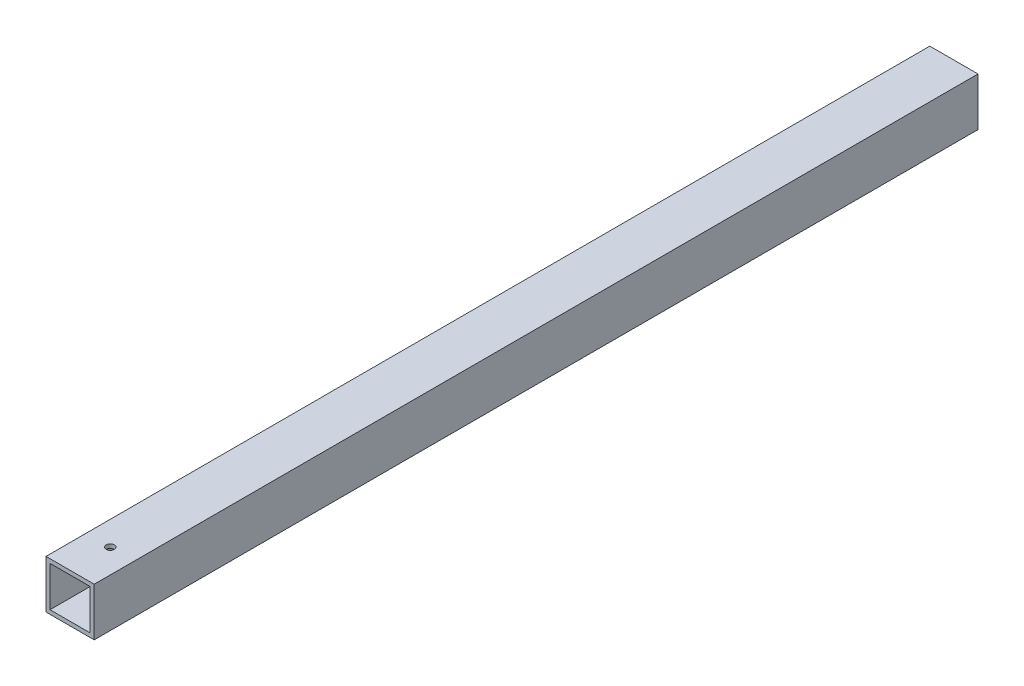
ISO-10303-21;
HEADER;
FILE_DESCRIPTION(('STEP AP214'),'2;1');
FILE_NAME('part.step','',(''),(''),'','','');
FILE_SCHEMA(('AUTOMOTIVE_DESIGN { 1 0 10303 214 1 1 1 1 }'));
ENDSEC;
DATA;
#1=APPLICATION_CONTEXT('core data for automotive mechanical design processes');
#2=APPLICATION_PROTOCOL_DEFINITION('international standard','automotive_design',2000,#1);
#3=PRODUCT_CONTEXT('',#1,'mechanical');
#4=PRODUCT('Part','Part','',(#3));
#5=PRODUCT_RELATED_PRODUCT_CATEGORY('part','',(#4));
#6=PRODUCT_DEFINITION_FORMATION('','',#4);
#7=PRODUCT_DEFINITION_CONTEXT('part definition',#1,'design');
#8=PRODUCT_DEFINITION('design','',#6,#7);
#9=PRODUCT_DEFINITION_SHAPE('','',#8);
#10=(LENGTH_UNIT() NAMED_UNIT(*) SI_UNIT(.MILLI.,.METRE.));
#11=(NAMED_UNIT(*) PLANE_ANGLE_UNIT() SI_UNIT($,.RADIAN.));
#12=(NAMED_UNIT(*) SI_UNIT($,.STERADIAN.) SOLID_ANGLE_UNIT());
#13=UNCERTAINTY_MEASURE_WITH_UNIT(LENGTH_MEASURE(1.E-05),#10,'distance_accuracy_value','');
#14=(GEOMETRIC_REPRESENTATION_CONTEXT(3) GLOBAL_UNCERTAINTY_ASSIGNED_CONTEXT((#13)) GLOBAL_UNIT_ASSIGNED_CONTEXT((#10,
#11,#12)) REPRESENTATION_CONTEXT('',''));
#15=CARTESIAN_POINT('',(0.,0.,0.));
#16=DIRECTION('',(0.,0.,1.));
#17=DIRECTION('',(1.,0.,0.));
#18=AXIS2_PLACEMENT_3D('',#15,#16,#17);
#19=CARTESIAN_POINT('',(0.,0.,220.00227405));
#20=DIRECTION('',(0.,0.,-1.));
#21=DIRECTION('',(-1.,0.,0.));
#22=AXIS2_PLACEMENT_3D('',#19,#20,#21);
#23=PLANE('',#22);
#24=DIRECTION('',(0.,-1.,0.));
#25=VECTOR('',#24,1.);
#26=CARTESIAN_POINT('',(0.,0.,220.00227405));
#27=LINE('',#26,#25);
#28=CARTESIAN_POINT('',(0.,12.,220.00227405));
#29=VERTEX_POINT('',#28);
#30=CARTESIAN_POINT('',(0.,0.,220.00227405));
#31=VERTEX_POINT('',#30);
#32=EDGE_CURVE('E137',#29,#31,#27,.T.);
#33=ORIENTED_EDGE('',*,*,#32,.T.);
#34=DIRECTION('',(1.,0.,0.));
#35=VECTOR('',#34,1.);
#36=CARTESIAN_POINT('',(0.,0.,220.00227405));
#37=LINE('',#36,#35);
#38=CARTESIAN_POINT('',(12.,0.,220.00227405));
#39=VERTEX_POINT('',#38);
#40=EDGE_CURVE('E140',#31,#39,#37,.T.);
#41=ORIENTED_EDGE('',*,*,#40,.T.);
#42=DIRECTION('',(0.,1.,0.));
#43=VECTOR('',#42,1.);
#44=CARTESIAN_POINT('',(12.,0.,220.00227405));
#45=LINE('',#44,#43);
#46=CARTESIAN_POINT('',(12.,12.,220.00227405));
#47=VERTEX_POINT('',#46);
#48=EDGE_CURVE('E143',#39,#47,#45,.T.);
#49=ORIENTED_EDGE('',*,*,#48,.T.);
#50=DIRECTION('',(-1.,0.,0.));
#51=VECTOR('',#50,1.);
#52=CARTESIAN_POINT('',(0.,12.,220.00227405));
#53=LINE('',#52,#51);
#54=EDGE_CURVE('E145',#47,#29,#53,.T.);
#55=ORIENTED_EDGE('',*,*,#54,.T.);
#56=EDGE_LOOP('',(#33,#41,#49,#55));
#57=FACE_BOUND('',#56,.T.);
#58=DIRECTION('',(0.,-1.,0.));
#59=VECTOR('',#58,1.);
#60=CARTESIAN_POINT('',(1.,1.,220.00227405));
#61=LINE('',#60,#59);
#62=CARTESIAN_POINT('',(1.,11.,220.00227405));
#63=VERTEX_POINT('',#62);
#64=CARTESIAN_POINT('',(1.,1.,220.00227405));
#65=VERTEX_POINT('',#64);
#66=EDGE_CURVE('E99',#63,#65,#61,.T.);
#67=ORIENTED_EDGE('',*,*,#66,.F.);
#68=DIRECTION('',(-1.,0.,0.));
#69=VECTOR('',#68,1.);
#70=CARTESIAN_POINT('',(1.,11.,220.00227405));
#71=LINE('',#70,#69);
#72=CARTESIAN_POINT('',(11.,11.,220.00227405));
#73=VERTEX_POINT('',#72);
#74=EDGE_CURVE('E121',#73,#63,#71,.T.);
#75=ORIENTED_EDGE('',*,*,#74,.F.);
#76=DIRECTION('',(0.,1.,0.));
#77=VECTOR('',#76,1.);
#78=CARTESIAN_POINT('',(11.,1.,220.00227405));
#79=LINE('',#78,#77);
#80=CARTESIAN_POINT('',(11.,1.,220.00227405));
#81=VERTEX_POINT('',#80);
#82=EDGE_CURVE('E119',#81,#73,#79,.T.);
#83=ORIENTED_EDGE('',*,*,#82,.F.);
#84=DIRECTION('',(1.,0.,0.));
#85=VECTOR('',#84,1.);
#86=CARTESIAN_POINT('',(1.,1.,220.00227405));
#87=LINE('',#86,#85);
#88=EDGE_CURVE('E107',#65,#81,#87,.T.);
#89=ORIENTED_EDGE('',*,*,#88,.F.);
#90=EDGE_LOOP('',(#67,#75,#83,#89));
#91=FACE_BOUND('',#90,.T.);
#92=ADVANCED_FACE('F33',(#57,#91),#23,.F.);
#93=CARTESIAN_POINT('',(0.,0.,0.));
#94=DIRECTION('',(0.,0.,-1.));
#95=DIRECTION('',(-1.,0.,0.));
#96=AXIS2_PLACEMENT_3D('',#93,#94,#95);
#97=PLANE('',#96);
#98=DIRECTION('',(0.,-1.,0.));
#99=VECTOR('',#98,1.);
#100=CARTESIAN_POINT('',(0.,0.,0.));
#101=LINE('',#100,#99);
#102=CARTESIAN_POINT('',(0.,12.,0.));
#103=VERTEX_POINT('',#102);
#104=CARTESIAN_POINT('',(0.,0.,0.));
#105=VERTEX_POINT('',#104);
#106=EDGE_CURVE('E115',#103,#105,#101,.T.);
#107=ORIENTED_EDGE('',*,*,#106,.F.);
#108=DIRECTION('',(-1.,0.,0.));
#109=VECTOR('',#108,1.);
#110=CARTESIAN_POINT('',(0.,12.,0.));
#111=LINE('',#110,#109);
#112=CARTESIAN_POINT('',(12.,12.,0.));
#113=VERTEX_POINT('',#112);
#114=EDGE_CURVE('E141',#113,#103,#111,.T.);
#115=ORIENTED_EDGE('',*,*,#114,.F.);
#116=DIRECTION('',(0.,1.,0.));
#117=VECTOR('',#116,1.);
#118=CARTESIAN_POINT('',(12.,0.,0.));
#119=LINE('',#118,#117);
#120=CARTESIAN_POINT('',(12.,0.,0.));
#121=VERTEX_POINT('',#120);
#122=EDGE_CURVE('E152',#121,#113,#119,.T.);
#123=ORIENTED_EDGE('',*,*,#122,.F.);
#124=DIRECTION('',(1.,0.,0.));
#125=VECTOR('',#124,1.);
#126=CARTESIAN_POINT('',(0.,0.,0.));
#127=LINE('',#126,#125);
#128=EDGE_CURVE('E150',#105,#121,#127,.T.);
#129=ORIENTED_EDGE('',*,*,#128,.F.);
#130=EDGE_LOOP('',(#107,#115,#123,#129));
#131=FACE_BOUND('',#130,.T.);
#132=DIRECTION('',(-1.,0.,0.));
#133=VECTOR('',#132,1.);
#134=CARTESIAN_POINT('',(1.,11.,0.));
#135=LINE('',#134,#133);
#136=CARTESIAN_POINT('',(11.,11.,0.));
#137=VERTEX_POINT('',#136);
#138=CARTESIAN_POINT('',(1.,11.,0.));
#139=VERTEX_POINT('',#138);
#140=EDGE_CURVE('E108',#137,#139,#135,.T.);
#141=ORIENTED_EDGE('',*,*,#140,.T.);
#142=DIRECTION('',(0.,-1.,0.));
#143=VECTOR('',#142,1.);
#144=CARTESIAN_POINT('',(1.,1.,0.));
#145=LINE('',#144,#143);
#146=CARTESIAN_POINT('',(1.,1.,0.));
#147=VERTEX_POINT('',#146);
#148=EDGE_CURVE('E57',#139,#147,#145,.T.);
#149=ORIENTED_EDGE('',*,*,#148,.T.);
#150=DIRECTION('',(1.,0.,0.));
#151=VECTOR('',#150,1.);
#152=CARTESIAN_POINT('',(1.,1.,0.));
#153=LINE('',#152,#151);
#154=CARTESIAN_POINT('',(11.,1.,0.));
#155=VERTEX_POINT('',#154);
#156=EDGE_CURVE('E114',#147,#155,#153,.T.);
#157=ORIENTED_EDGE('',*,*,#156,.T.);
#158=DIRECTION('',(0.,1.,0.));
#159=VECTOR('',#158,1.);
#160=CARTESIAN_POINT('',(11.,1.,0.));
#161=LINE('',#160,#159);
#162=EDGE_CURVE('E129',#155,#137,#161,.T.);
#163=ORIENTED_EDGE('',*,*,#162,.T.);
#164=EDGE_LOOP('',(#141,#149,#157,#163));
#165=FACE_BOUND('',#164,.T.);
#166=ADVANCED_FACE('F171',(#131,#165),#97,.T.);
#167=CARTESIAN_POINT('',(0.,0.,220.00227405));
#168=DIRECTION('',(1.,0.,0.));
#169=DIRECTION('',(0.,0.,-1.));
#170=AXIS2_PLACEMENT_3D('',#167,#168,#169);
#171=PLANE('',#170);
#172=ORIENTED_EDGE('',*,*,#106,.T.);
#173=DIRECTION('',(0.,0.,-1.));
#174=VECTOR('',#173,1.);
#175=CARTESIAN_POINT('',(0.,0.,220.00227405));
#176=LINE('',#175,#174);
#177=EDGE_CURVE('E11',#31,#105,#176,.T.);
#178=ORIENTED_EDGE('',*,*,#177,.F.);
#179=ORIENTED_EDGE('',*,*,#32,.F.);
#180=DIRECTION('',(0.,0.,-1.));
#181=VECTOR('',#180,1.);
#182=CARTESIAN_POINT('',(0.,12.,220.00227405));
#183=LINE('',#182,#181);
#184=EDGE_CURVE('E147',#29,#103,#183,.T.);
#185=ORIENTED_EDGE('',*,*,#184,.T.);
#186=EDGE_LOOP('',(#172,#178,#179,#185));
#187=FACE_BOUND('',#186,.T.);
#188=ADVANCED_FACE('F35',(#187),#171,.F.);
#189=CARTESIAN_POINT('',(0.,0.,220.00227405));
#190=DIRECTION('',(0.,1.,0.));
#191=DIRECTION('',(0.,0.,1.));
#192=AXIS2_PLACEMENT_3D('',#189,#190,#191);
#193=PLANE('',#192);
#194=CARTESIAN_POINT('',(6.,0.,210.00227405));
#195=DIRECTION('',(0.,-1.,0.));
#196=DIRECTION('',(0.,0.,-1.));
#197=AXIS2_PLACEMENT_3D('',#194,#195,#196);
#198=CIRCLE('',#197,1.);
#199=CARTESIAN_POINT('',(6.,0.,209.00227405));
#200=VERTEX_POINT('',#199);
#201=EDGE_CURVE('E208',#200,#200,#198,.T.);
#202=ORIENTED_EDGE('',*,*,#201,.F.);
#203=EDGE_LOOP('',(#202));
#204=FACE_BOUND('',#203,.T.);
#205=ORIENTED_EDGE('',*,*,#128,.T.);
#206=DIRECTION('',(0.,0.,-1.));
#207=VECTOR('',#206,1.);
#208=CARTESIAN_POINT('',(12.,0.,220.00227405));
#209=LINE('',#208,#207);
#210=EDGE_CURVE('E42',#39,#121,#209,.T.);
#211=ORIENTED_EDGE('',*,*,#210,.F.);
#212=ORIENTED_EDGE('',*,*,#40,.F.);
#213=ORIENTED_EDGE('',*,*,#177,.T.);
#214=EDGE_LOOP('',(#205,#211,#212,#213));
#215=FACE_BOUND('',#214,.T.);
#216=ADVANCED_FACE('F181',(#204,#215),#193,.F.);
#217=CARTESIAN_POINT('',(12.,0.,220.00227405));
#218=DIRECTION('',(-1.,0.,0.));
#219=DIRECTION('',(0.,0.,1.));
#220=AXIS2_PLACEMENT_3D('',#217,#218,#219);
#221=PLANE('',#220);
#222=ORIENTED_EDGE('',*,*,#122,.T.);
#223=DIRECTION('',(0.,0.,-1.));
#224=VECTOR('',#223,1.);
#225=CARTESIAN_POINT('',(12.,12.,220.00227405));
#226=LINE('',#225,#224);
#227=EDGE_CURVE('E157',#47,#113,#226,.T.);
#228=ORIENTED_EDGE('',*,*,#227,.F.);
#229=ORIENTED_EDGE('',*,*,#48,.F.);
#230=ORIENTED_EDGE('',*,*,#210,.T.);
#231=EDGE_LOOP('',(#222,#228,#229,#230));
#232=FACE_BOUND('',#231,.T.);
#233=ADVANCED_FACE('F165',(#232),#221,.F.);
#234=CARTESIAN_POINT('',(0.,12.,220.00227405));
#235=DIRECTION('',(0.,-1.,0.));
#236=DIRECTION('',(0.,0.,-1.));
#237=AXIS2_PLACEMENT_3D('',#234,#235,#236);
#238=PLANE('',#237);
#239=CARTESIAN_POINT('',(6.,12.,210.00227405));
#240=DIRECTION('',(0.,-1.,0.));
#241=DIRECTION('',(0.,0.,-1.));
#242=AXIS2_PLACEMENT_3D('',#239,#240,#241);
#243=CIRCLE('',#242,1.);
#244=CARTESIAN_POINT('',(6.,12.,209.00227405));
#245=VERTEX_POINT('',#244);
#246=EDGE_CURVE('E206',#245,#245,#243,.T.);
#247=ORIENTED_EDGE('',*,*,#246,.T.);
#248=EDGE_LOOP('',(#247));
#249=FACE_BOUND('',#248,.T.);
#250=ORIENTED_EDGE('',*,*,#114,.T.);
#251=ORIENTED_EDGE('',*,*,#184,.F.);
#252=ORIENTED_EDGE('',*,*,#54,.F.);
#253=ORIENTED_EDGE('',*,*,#227,.T.);
#254=EDGE_LOOP('',(#250,#251,#252,#253));
#255=FACE_BOUND('',#254,.T.);
#256=ADVANCED_FACE('F175',(#249,#255),#238,.F.);
#257=CARTESIAN_POINT('',(1.,1.,220.00227405));
#258=DIRECTION('',(1.,0.,0.));
#259=DIRECTION('',(0.,0.,-1.));
#260=AXIS2_PLACEMENT_3D('',#257,#258,#259);
#261=PLANE('',#260);
#262=ORIENTED_EDGE('',*,*,#148,.F.);
#263=DIRECTION('',(0.,0.,-1.));
#264=VECTOR('',#263,1.);
#265=CARTESIAN_POINT('',(1.,11.,220.00227405));
#266=LINE('',#265,#264);
#267=EDGE_CURVE('E103',#63,#139,#266,.T.);
#268=ORIENTED_EDGE('',*,*,#267,.F.);
#269=ORIENTED_EDGE('',*,*,#66,.T.);
#270=DIRECTION('',(0.,0.,-1.));
#271=VECTOR('',#270,1.);
#272=CARTESIAN_POINT('',(1.,1.,220.00227405));
#273=LINE('',#272,#271);
#274=EDGE_CURVE('E102',#65,#147,#273,.T.);
#275=ORIENTED_EDGE('',*,*,#274,.T.);
#276=EDGE_LOOP('',(#262,#268,#269,#275));
#277=FACE_BOUND('',#276,.T.);
#278=ADVANCED_FACE('F101',(#277),#261,.T.);
#279=CARTESIAN_POINT('',(1.,1.,220.00227405));
#280=DIRECTION('',(0.,1.,0.));
#281=DIRECTION('',(0.,0.,1.));
#282=AXIS2_PLACEMENT_3D('',#279,#280,#281);
#283=PLANE('',#282);
#284=CARTESIAN_POINT('',(6.,1.,210.00227405));
#285=DIRECTION('',(0.,1.,0.));
#286=DIRECTION('',(0.,0.,1.));
#287=AXIS2_PLACEMENT_3D('',#284,#285,#286);
#288=CIRCLE('',#287,1.);
#289=CARTESIAN_POINT('',(6.,1.,211.00227405));
#290=VERTEX_POINT('',#289);
#291=EDGE_CURVE('E127',#290,#290,#288,.T.);
#292=ORIENTED_EDGE('',*,*,#291,.F.);
#293=EDGE_LOOP('',(#292));
#294=FACE_BOUND('',#293,.T.);
#295=ORIENTED_EDGE('',*,*,#156,.F.);
#296=ORIENTED_EDGE('',*,*,#274,.F.);
#297=ORIENTED_EDGE('',*,*,#88,.T.);
#298=DIRECTION('',(0.,0.,-1.));
#299=VECTOR('',#298,1.);
#300=CARTESIAN_POINT('',(11.,1.,220.00227405));
#301=LINE('',#300,#299);
#302=EDGE_CURVE('E116',#81,#155,#301,.T.);
#303=ORIENTED_EDGE('',*,*,#302,.T.);
#304=EDGE_LOOP('',(#295,#296,#297,#303));
#305=FACE_BOUND('',#304,.T.);
#306=ADVANCED_FACE('F111',(#294,#305),#283,.T.);
#307=CARTESIAN_POINT('',(11.,1.,220.00227405));
#308=DIRECTION('',(-1.,0.,0.));
#309=DIRECTION('',(0.,0.,1.));
#310=AXIS2_PLACEMENT_3D('',#307,#308,#309);
#311=PLANE('',#310);
#312=ORIENTED_EDGE('',*,*,#162,.F.);
#313=ORIENTED_EDGE('',*,*,#302,.F.);
#314=ORIENTED_EDGE('',*,*,#82,.T.);
#315=DIRECTION('',(0.,0.,-1.));
#316=VECTOR('',#315,1.);
#317=CARTESIAN_POINT('',(11.,11.,220.00227405));
#318=LINE('',#317,#316);
#319=EDGE_CURVE('E49',#73,#137,#318,.T.);
#320=ORIENTED_EDGE('',*,*,#319,.T.);
#321=EDGE_LOOP('',(#312,#313,#314,#320));
#322=FACE_BOUND('',#321,.T.);
#323=ADVANCED_FACE('F220',(#322),#311,.T.);
#324=CARTESIAN_POINT('',(1.,11.,220.00227405));
#325=DIRECTION('',(0.,-1.,0.));
#326=DIRECTION('',(0.,0.,-1.));
#327=AXIS2_PLACEMENT_3D('',#324,#325,#326);
#328=PLANE('',#327);
#329=CARTESIAN_POINT('',(6.,11.,210.00227405));
#330=DIRECTION('',(0.,-1.,0.));
#331=DIRECTION('',(0.,0.,-1.));
#332=AXIS2_PLACEMENT_3D('',#329,#330,#331);
#333=CIRCLE('',#332,1.);
#334=CARTESIAN_POINT('',(6.,11.,209.00227405));
#335=VERTEX_POINT('',#334);
#336=EDGE_CURVE('E37',#335,#335,#333,.T.);
#337=ORIENTED_EDGE('',*,*,#336,.F.);
#338=EDGE_LOOP('',(#337));
#339=FACE_BOUND('',#338,.T.);
#340=ORIENTED_EDGE('',*,*,#140,.F.);
#341=ORIENTED_EDGE('',*,*,#319,.F.);
#342=ORIENTED_EDGE('',*,*,#74,.T.);
#343=ORIENTED_EDGE('',*,*,#267,.T.);
#344=EDGE_LOOP('',(#340,#341,#342,#343));
#345=FACE_BOUND('',#344,.T.);
#346=ADVANCED_FACE('F224',(#339,#345),#328,.T.);
#347=CARTESIAN_POINT('',(6.,12.,210.00227405));
#348=DIRECTION('',(0.,-1.,0.));
#349=DIRECTION('',(0.,0.,-1.));
#350=AXIS2_PLACEMENT_3D('',#347,#348,#349);
#351=CYLINDRICAL_SURFACE('',#350,1.);
#352=ORIENTED_EDGE('',*,*,#336,.T.);
#353=EDGE_LOOP('',(#352));
#354=FACE_BOUND('',#353,.T.);
#355=ORIENTED_EDGE('',*,*,#246,.F.);
#356=EDGE_LOOP('',(#355));
#357=FACE_BOUND('',#356,.T.);
#358=ADVANCED_FACE('F230',(#354,#357),#351,.F.);
#359=ORIENTED_EDGE('',*,*,#291,.T.);
#360=EDGE_LOOP('',(#359));
#361=FACE_BOUND('',#360,.T.);
#362=ORIENTED_EDGE('',*,*,#201,.T.);
#363=EDGE_LOOP('',(#362));
#364=FACE_BOUND('',#363,.T.);
#365=ADVANCED_FACE('F216',(#361,#364),#351,.F.);
#366=CLOSED_SHELL('',(#92,#166,#188,#216,#233,#256,#278,#306,#323,#346,#358,#365));
#367=MANIFOLD_SOLID_BREP('B2',#366);
#368=ADVANCED_BREP_SHAPE_REPRESENTATION('',(#18,#367),#14);
#369=SHAPE_DEFINITION_REPRESENTATION(#9,#368);
ENDSEC;
END-ISO-10303-21;
